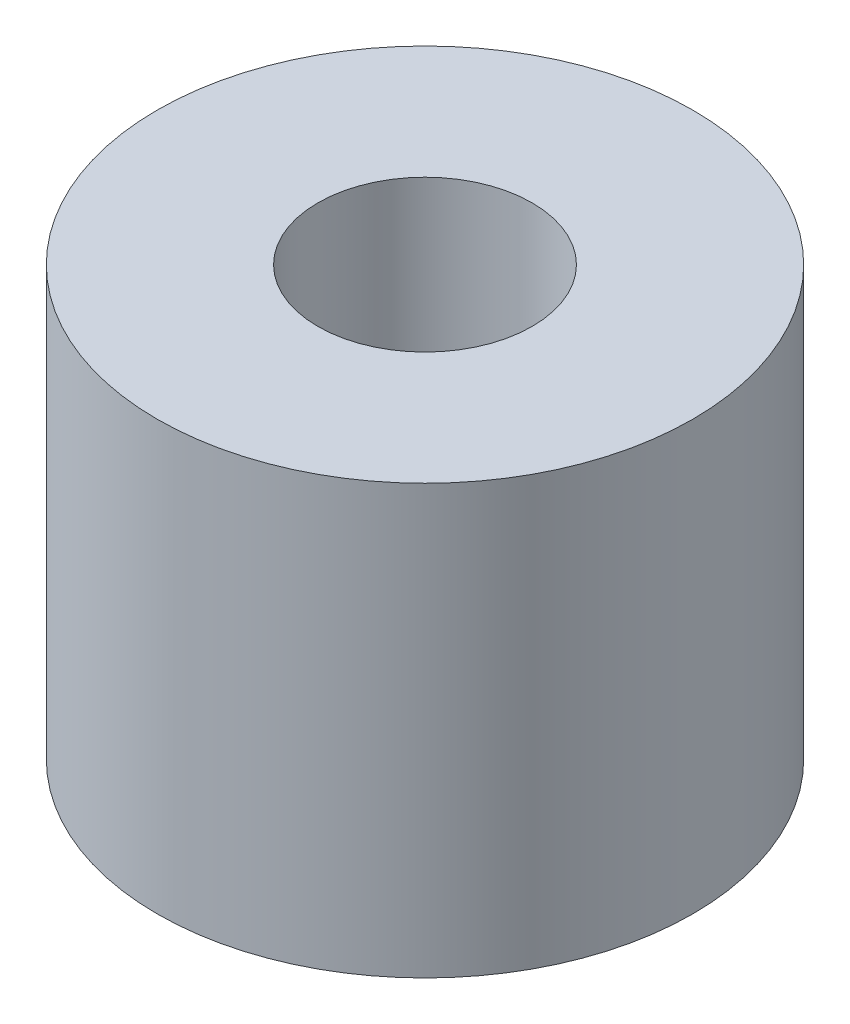
ISO-10303-21;
HEADER;
FILE_DESCRIPTION(('STEP AP214'),'2;1');
FILE_NAME('part.step','',(''),(''),'','','');
FILE_SCHEMA(('AUTOMOTIVE_DESIGN { 1 0 10303 214 1 1 1 1 }'));
ENDSEC;
DATA;
#1=APPLICATION_CONTEXT('core data for automotive mechanical design processes');
#2=APPLICATION_PROTOCOL_DEFINITION('international standard','automotive_design',2000,#1);
#3=PRODUCT_CONTEXT('',#1,'mechanical');
#4=PRODUCT('Part','Part','',(#3));
#5=PRODUCT_RELATED_PRODUCT_CATEGORY('part','',(#4));
#6=PRODUCT_DEFINITION_FORMATION('','',#4);
#7=PRODUCT_DEFINITION_CONTEXT('part definition',#1,'design');
#8=PRODUCT_DEFINITION('design','',#6,#7);
#9=PRODUCT_DEFINITION_SHAPE('','',#8);
#10=(LENGTH_UNIT() NAMED_UNIT(*) SI_UNIT(.MILLI.,.METRE.));
#11=(NAMED_UNIT(*) PLANE_ANGLE_UNIT() SI_UNIT($,.RADIAN.));
#12=(NAMED_UNIT(*) SI_UNIT($,.STERADIAN.) SOLID_ANGLE_UNIT());
#13=UNCERTAINTY_MEASURE_WITH_UNIT(LENGTH_MEASURE(1.E-05),#10,'distance_accuracy_value','');
#14=(GEOMETRIC_REPRESENTATION_CONTEXT(3) GLOBAL_UNCERTAINTY_ASSIGNED_CONTEXT((#13)) GLOBAL_UNIT_ASSIGNED_CONTEXT((#10,
#11,#12)) REPRESENTATION_CONTEXT('',''));
#15=CARTESIAN_POINT('',(0.,0.,0.));
#16=DIRECTION('',(0.,0.,1.));
#17=DIRECTION('',(1.,0.,0.));
#18=AXIS2_PLACEMENT_3D('',#15,#16,#17);
#19=CARTESIAN_POINT('',(0.,4.,0.));
#20=DIRECTION('',(0.,1.,0.));
#21=DIRECTION('',(0.,0.,1.));
#22=AXIS2_PLACEMENT_3D('',#19,#20,#21);
#23=PLANE('',#22);
#24=CARTESIAN_POINT('',(0.,4.,0.));
#25=DIRECTION('',(0.,1.,0.));
#26=DIRECTION('',(0.,0.,1.));
#27=AXIS2_PLACEMENT_3D('',#24,#25,#26);
#28=CIRCLE('',#27,2.5);
#29=CARTESIAN_POINT('',(0.,4.,2.5));
#30=VERTEX_POINT('',#29);
#31=EDGE_CURVE('E10',#30,#30,#28,.T.);
#32=ORIENTED_EDGE('',*,*,#31,.T.);
#33=EDGE_LOOP('',(#32));
#34=FACE_BOUND('',#33,.T.);
#35=CARTESIAN_POINT('',(0.,4.,0.));
#36=DIRECTION('',(0.,1.,0.));
#37=DIRECTION('',(0.,0.,1.));
#38=AXIS2_PLACEMENT_3D('',#35,#36,#37);
#39=CIRCLE('',#38,1.);
#40=CARTESIAN_POINT('',(0.,4.,1.));
#41=VERTEX_POINT('',#40);
#42=EDGE_CURVE('E43',#41,#41,#39,.T.);
#43=ORIENTED_EDGE('',*,*,#42,.F.);
#44=EDGE_LOOP('',(#43));
#45=FACE_BOUND('',#44,.T.);
#46=ADVANCED_FACE('F32',(#34,#45),#23,.T.);
#47=CARTESIAN_POINT('',(0.,0.,0.));
#48=DIRECTION('',(0.,1.,0.));
#49=DIRECTION('',(0.,0.,1.));
#50=AXIS2_PLACEMENT_3D('',#47,#48,#49);
#51=PLANE('',#50);
#52=CARTESIAN_POINT('',(0.,0.,0.));
#53=DIRECTION('',(0.,1.,0.));
#54=DIRECTION('',(0.,0.,1.));
#55=AXIS2_PLACEMENT_3D('',#52,#53,#54);
#56=CIRCLE('',#55,2.5);
#57=CARTESIAN_POINT('',(0.,0.,2.5));
#58=VERTEX_POINT('',#57);
#59=EDGE_CURVE('E36',#58,#58,#56,.T.);
#60=ORIENTED_EDGE('',*,*,#59,.F.);
#61=EDGE_LOOP('',(#60));
#62=FACE_BOUND('',#61,.T.);
#63=CARTESIAN_POINT('',(0.,0.,0.));
#64=DIRECTION('',(0.,1.,0.));
#65=DIRECTION('',(0.,0.,1.));
#66=AXIS2_PLACEMENT_3D('',#63,#64,#65);
#67=CIRCLE('',#66,1.);
#68=CARTESIAN_POINT('',(0.,0.,1.));
#69=VERTEX_POINT('',#68);
#70=EDGE_CURVE('E45',#69,#69,#67,.T.);
#71=ORIENTED_EDGE('',*,*,#70,.T.);
#72=EDGE_LOOP('',(#71));
#73=FACE_BOUND('',#72,.T.);
#74=ADVANCED_FACE('F55',(#62,#73),#51,.F.);
#75=CARTESIAN_POINT('',(0.,4.,0.));
#76=DIRECTION('',(0.,-1.,0.));
#77=DIRECTION('',(0.,0.,-1.));
#78=AXIS2_PLACEMENT_3D('',#75,#76,#77);
#79=CYLINDRICAL_SURFACE('',#78,2.5);
#80=ORIENTED_EDGE('',*,*,#31,.F.);
#81=EDGE_LOOP('',(#80));
#82=FACE_BOUND('',#81,.T.);
#83=ORIENTED_EDGE('',*,*,#59,.T.);
#84=EDGE_LOOP('',(#83));
#85=FACE_BOUND('',#84,.T.);
#86=ADVANCED_FACE('F34',(#82,#85),#79,.T.);
#87=CARTESIAN_POINT('',(0.,4.,0.));
#88=DIRECTION('',(0.,-1.,0.));
#89=DIRECTION('',(0.,0.,-1.));
#90=AXIS2_PLACEMENT_3D('',#87,#88,#89);
#91=CYLINDRICAL_SURFACE('',#90,1.);
#92=ORIENTED_EDGE('',*,*,#42,.T.);
#93=EDGE_LOOP('',(#92));
#94=FACE_BOUND('',#93,.T.);
#95=ORIENTED_EDGE('',*,*,#70,.F.);
#96=EDGE_LOOP('',(#95));
#97=FACE_BOUND('',#96,.T.);
#98=ADVANCED_FACE('F51',(#94,#97),#91,.F.);
#99=CLOSED_SHELL('',(#46,#74,#86,#98));
#100=MANIFOLD_SOLID_BREP('B2',#99);
#101=ADVANCED_BREP_SHAPE_REPRESENTATION('',(#18,#100),#14);
#102=SHAPE_DEFINITION_REPRESENTATION(#9,#101);
ENDSEC;
END-ISO-10303-21;
